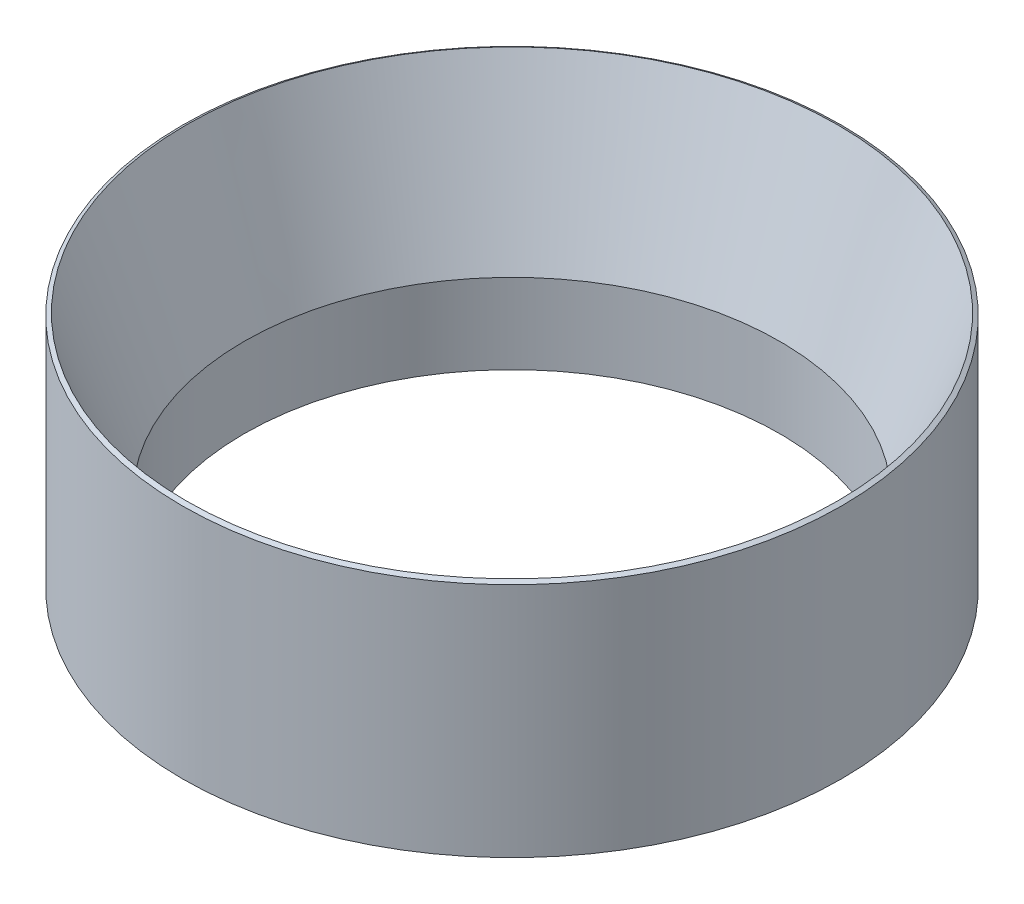
ISO-10303-21;
HEADER;
FILE_DESCRIPTION(('STEP AP214'),'2;1');
FILE_NAME('part.step','',(''),(''),'','','');
FILE_SCHEMA(('AUTOMOTIVE_DESIGN { 1 0 10303 214 1 1 1 1 }'));
ENDSEC;
DATA;
#1=APPLICATION_CONTEXT('core data for automotive mechanical design processes');
#2=APPLICATION_PROTOCOL_DEFINITION('international standard','automotive_design',2000,#1);
#3=PRODUCT_CONTEXT('',#1,'mechanical');
#4=PRODUCT('Part','Part','',(#3));
#5=PRODUCT_RELATED_PRODUCT_CATEGORY('part','',(#4));
#6=PRODUCT_DEFINITION_FORMATION('','',#4);
#7=PRODUCT_DEFINITION_CONTEXT('part definition',#1,'design');
#8=PRODUCT_DEFINITION('design','',#6,#7);
#9=PRODUCT_DEFINITION_SHAPE('','',#8);
#10=(LENGTH_UNIT() NAMED_UNIT(*) SI_UNIT(.MILLI.,.METRE.));
#11=(NAMED_UNIT(*) PLANE_ANGLE_UNIT() SI_UNIT($,.RADIAN.));
#12=(NAMED_UNIT(*) SI_UNIT($,.STERADIAN.) SOLID_ANGLE_UNIT());
#13=UNCERTAINTY_MEASURE_WITH_UNIT(LENGTH_MEASURE(1.E-05),#10,'distance_accuracy_value','');
#14=(GEOMETRIC_REPRESENTATION_CONTEXT(3) GLOBAL_UNCERTAINTY_ASSIGNED_CONTEXT((#13)) GLOBAL_UNIT_ASSIGNED_CONTEXT((#10,
#11,#12)) REPRESENTATION_CONTEXT('',''));
#15=CARTESIAN_POINT('',(0.,0.,0.));
#16=DIRECTION('',(0.,0.,1.));
#17=DIRECTION('',(1.,0.,0.));
#18=AXIS2_PLACEMENT_3D('',#15,#16,#17);
#19=CARTESIAN_POINT('',(0.,12.7,0.));
#20=DIRECTION('',(0.,1.,0.));
#21=DIRECTION('',(-1.,0.,0.));
#22=AXIS2_PLACEMENT_3D('',#19,#20,#21);
#23=CONICAL_SURFACE('',#22,42.545,0.349065850398867);
#24=CARTESIAN_POINT('',(0.,37.8927194499471,0.));
#25=DIRECTION('',(0.,1.,0.));
#26=DIRECTION('',(-1.,0.,0.));
#27=AXIS2_PLACEMENT_3D('',#24,#25,#26);
#28=CIRCLE('',#27,51.7144);
#29=CARTESIAN_POINT('',(-51.7144,37.8927194499471,0.));
#30=VERTEX_POINT('',#29);
#31=EDGE_CURVE('E62',#30,#30,#28,.T.);
#32=ORIENTED_EDGE('',*,*,#31,.T.);
#33=EDGE_LOOP('',(#32));
#34=FACE_BOUND('',#33,.T.);
#35=CARTESIAN_POINT('',(0.,12.7,0.));
#36=DIRECTION('',(0.,1.,0.));
#37=DIRECTION('',(-1.,0.,0.));
#38=AXIS2_PLACEMENT_3D('',#35,#36,#37);
#39=CIRCLE('',#38,42.545);
#40=CARTESIAN_POINT('',(-42.545,12.7,0.));
#41=VERTEX_POINT('',#40);
#42=EDGE_CURVE('E10',#41,#41,#39,.T.);
#43=ORIENTED_EDGE('',*,*,#42,.F.);
#44=EDGE_LOOP('',(#43));
#45=FACE_BOUND('',#44,.T.);
#46=ADVANCED_FACE('F39',(#34,#45),#23,.F.);
#47=CARTESIAN_POINT('',(0.,39.6373676113008,0.));
#48=DIRECTION('',(0.,1.,0.));
#49=DIRECTION('',(-1.,0.,0.));
#50=AXIS2_PLACEMENT_3D('',#47,#48,#49);
#51=CYLINDRICAL_SURFACE('',#50,42.545);
#52=CARTESIAN_POINT('',(0.,0.,0.));
#53=DIRECTION('',(0.,1.,0.));
#54=DIRECTION('',(-1.,0.,0.));
#55=AXIS2_PLACEMENT_3D('',#52,#53,#54);
#56=CIRCLE('',#55,42.545);
#57=CARTESIAN_POINT('',(-42.545,0.,0.));
#58=VERTEX_POINT('',#57);
#59=EDGE_CURVE('E46',#58,#58,#56,.T.);
#60=ORIENTED_EDGE('',*,*,#59,.F.);
#61=EDGE_LOOP('',(#60));
#62=FACE_BOUND('',#61,.T.);
#63=ORIENTED_EDGE('',*,*,#42,.T.);
#64=EDGE_LOOP('',(#63));
#65=FACE_BOUND('',#64,.T.);
#66=ADVANCED_FACE('F81',(#62,#65),#51,.F.);
#67=CARTESIAN_POINT('',(0.,0.,0.));
#68=DIRECTION('',(0.,-1.,0.));
#69=DIRECTION('',(1.,0.,0.));
#70=AXIS2_PLACEMENT_3D('',#67,#68,#69);
#71=PLANE('',#70);
#72=ORIENTED_EDGE('',*,*,#59,.T.);
#73=EDGE_LOOP('',(#72));
#74=FACE_BOUND('',#73,.T.);
#75=CARTESIAN_POINT('',(0.,0.,0.));
#76=DIRECTION('',(0.,1.,0.));
#77=DIRECTION('',(-1.,0.,0.));
#78=AXIS2_PLACEMENT_3D('',#75,#76,#77);
#79=CIRCLE('',#78,52.3494);
#80=CARTESIAN_POINT('',(-52.3494,0.,0.));
#81=VERTEX_POINT('',#80);
#82=EDGE_CURVE('E53',#81,#81,#79,.T.);
#83=ORIENTED_EDGE('',*,*,#82,.F.);
#84=EDGE_LOOP('',(#83));
#85=FACE_BOUND('',#84,.T.);
#86=ADVANCED_FACE('F77',(#74,#85),#71,.T.);
#87=CARTESIAN_POINT('',(0.,39.6373676113008,0.));
#88=DIRECTION('',(0.,1.,0.));
#89=DIRECTION('',(-1.,0.,0.));
#90=AXIS2_PLACEMENT_3D('',#87,#88,#89);
#91=CYLINDRICAL_SURFACE('',#90,52.3494);
#92=ORIENTED_EDGE('',*,*,#82,.T.);
#93=EDGE_LOOP('',(#92));
#94=FACE_BOUND('',#93,.T.);
#95=CARTESIAN_POINT('',(0.,37.5261020290118,0.));
#96=DIRECTION('',(0.,1.,0.));
#97=DIRECTION('',(-1.,0.,0.));
#98=AXIS2_PLACEMENT_3D('',#95,#96,#97);
#99=CIRCLE('',#98,52.3494);
#100=CARTESIAN_POINT('',(-52.3494,37.5261020290118,0.));
#101=VERTEX_POINT('',#100);
#102=EDGE_CURVE('E57',#101,#101,#99,.T.);
#103=ORIENTED_EDGE('',*,*,#102,.F.);
#104=EDGE_LOOP('',(#103));
#105=FACE_BOUND('',#104,.T.);
#106=ADVANCED_FACE('F71',(#94,#105),#91,.T.);
#107=CARTESIAN_POINT('',(0.,37.8927194499471,0.));
#108=DIRECTION('',(0.,-1.,0.));
#109=DIRECTION('',(1.,0.,0.));
#110=AXIS2_PLACEMENT_3D('',#107,#108,#109);
#111=CONICAL_SURFACE('',#110,51.7144,1.04719755119664);
#112=ORIENTED_EDGE('',*,*,#102,.T.);
#113=EDGE_LOOP('',(#112));
#114=FACE_BOUND('',#113,.T.);
#115=ORIENTED_EDGE('',*,*,#31,.F.);
#116=EDGE_LOOP('',(#115));
#117=FACE_BOUND('',#116,.T.);
#118=ADVANCED_FACE('F69',(#114,#117),#111,.T.);
#119=CLOSED_SHELL('',(#46,#66,#86,#106,#118));
#120=MANIFOLD_SOLID_BREP('B2',#119);
#121=ADVANCED_BREP_SHAPE_REPRESENTATION('',(#18,#120),#14);
#122=SHAPE_DEFINITION_REPRESENTATION(#9,#121);
ENDSEC;
END-ISO-10303-21;
